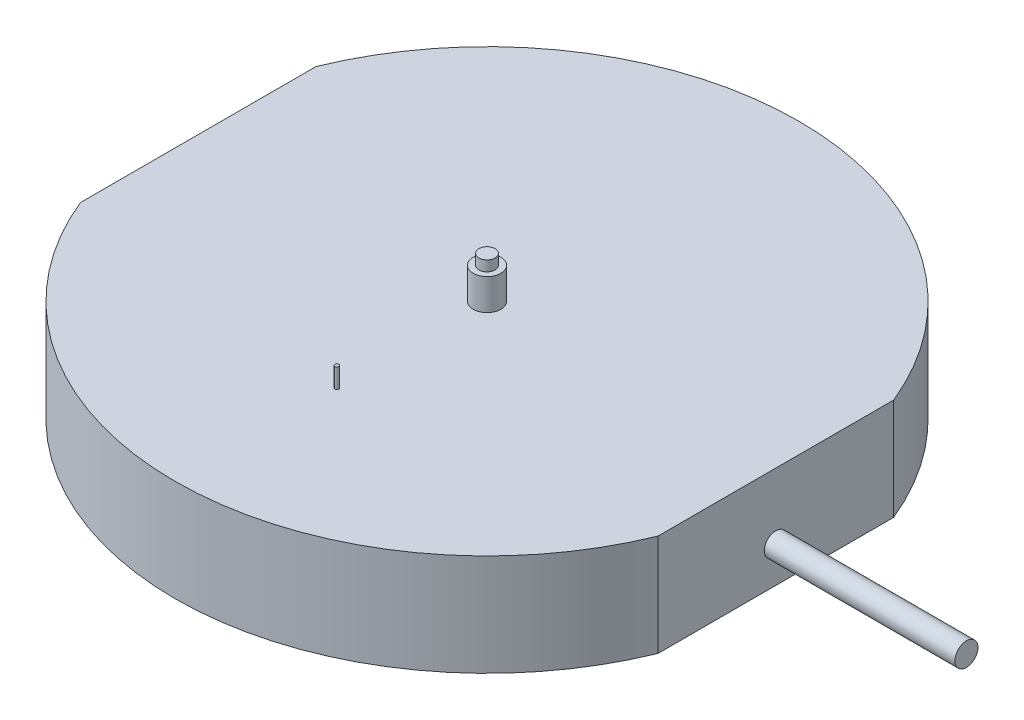
ISO-10303-21;
HEADER;
FILE_DESCRIPTION(('STEP AP214'),'2;1');
FILE_NAME('part.step','',(''),(''),'','','');
FILE_SCHEMA(('AUTOMOTIVE_DESIGN { 1 0 10303 214 1 1 1 1 }'));
ENDSEC;
DATA;
#1=APPLICATION_CONTEXT('core data for automotive mechanical design processes');
#2=APPLICATION_PROTOCOL_DEFINITION('international standard','automotive_design',2000,#1);
#3=PRODUCT_CONTEXT('',#1,'mechanical');
#4=PRODUCT('Part','Part','',(#3));
#5=PRODUCT_RELATED_PRODUCT_CATEGORY('part','',(#4));
#6=PRODUCT_DEFINITION_FORMATION('','',#4);
#7=PRODUCT_DEFINITION_CONTEXT('part definition',#1,'design');
#8=PRODUCT_DEFINITION('design','',#6,#7);
#9=PRODUCT_DEFINITION_SHAPE('','',#8);
#10=(LENGTH_UNIT() NAMED_UNIT(*) SI_UNIT(.MILLI.,.METRE.));
#11=(NAMED_UNIT(*) PLANE_ANGLE_UNIT() SI_UNIT($,.RADIAN.));
#12=(NAMED_UNIT(*) SI_UNIT($,.STERADIAN.) SOLID_ANGLE_UNIT());
#13=UNCERTAINTY_MEASURE_WITH_UNIT(LENGTH_MEASURE(1.E-05),#10,'distance_accuracy_value','');
#14=(GEOMETRIC_REPRESENTATION_CONTEXT(3) GLOBAL_UNCERTAINTY_ASSIGNED_CONTEXT((#13)) GLOBAL_UNIT_ASSIGNED_CONTEXT((#10,
#11,#12)) REPRESENTATION_CONTEXT('',''));
#15=CARTESIAN_POINT('',(0.,0.,0.));
#16=DIRECTION('',(0.,0.,1.));
#17=DIRECTION('',(1.,0.,0.));
#18=AXIS2_PLACEMENT_3D('',#15,#16,#17);
#19=CARTESIAN_POINT('',(0.,4.4,0.));
#20=DIRECTION('',(0.,-1.,0.));
#21=DIRECTION('',(0.,0.,-1.));
#22=AXIS2_PLACEMENT_3D('',#19,#20,#21);
#23=CYLINDRICAL_SURFACE('',#22,13.5);
#24=DIRECTION('',(0.,-1.,0.));
#25=VECTOR('',#24,1.);
#26=CARTESIAN_POINT('',(12.5,4.4,5.09901951359278));
#27=LINE('',#26,#25);
#28=CARTESIAN_POINT('',(12.5,4.4,5.09901951359278));
#29=VERTEX_POINT('',#28);
#30=CARTESIAN_POINT('',(12.5,0.,5.09901951359278));
#31=VERTEX_POINT('',#30);
#32=EDGE_CURVE('E55',#29,#31,#27,.T.);
#33=ORIENTED_EDGE('',*,*,#32,.F.);
#34=CARTESIAN_POINT('',(0.,4.4,0.));
#35=DIRECTION('',(0.,1.,0.));
#36=DIRECTION('',(0.,0.,1.));
#37=AXIS2_PLACEMENT_3D('',#34,#35,#36);
#38=CIRCLE('',#37,13.5);
#39=CARTESIAN_POINT('',(-12.5,4.4,5.09901951359278));
#40=VERTEX_POINT('',#39);
#41=EDGE_CURVE('E85',#40,#29,#38,.T.);
#42=ORIENTED_EDGE('',*,*,#41,.F.);
#43=DIRECTION('',(0.,-1.,0.));
#44=VECTOR('',#43,1.);
#45=CARTESIAN_POINT('',(-12.5,4.4,5.09901951359278));
#46=LINE('',#45,#44);
#47=CARTESIAN_POINT('',(-12.5,0.,5.09901951359278));
#48=VERTEX_POINT('',#47);
#49=EDGE_CURVE('E73',#48,#40,#46,.F.);
#50=ORIENTED_EDGE('',*,*,#49,.F.);
#51=CARTESIAN_POINT('',(0.,0.,0.));
#52=DIRECTION('',(0.,1.,0.));
#53=DIRECTION('',(0.,0.,1.));
#54=AXIS2_PLACEMENT_3D('',#51,#52,#53);
#55=CIRCLE('',#54,13.5);
#56=EDGE_CURVE('E83',#48,#31,#55,.T.);
#57=ORIENTED_EDGE('',*,*,#56,.T.);
#58=EDGE_LOOP('',(#33,#42,#50,#57));
#59=FACE_BOUND('',#58,.T.);
#60=ADVANCED_FACE('F32',(#59),#23,.T.);
#61=DIRECTION('',(0.,-1.,0.));
#62=VECTOR('',#61,1.);
#63=CARTESIAN_POINT('',(12.5,4.4,-5.09901951359278));
#64=LINE('',#63,#62);
#65=CARTESIAN_POINT('',(12.5,0.,-5.09901951359278));
#66=VERTEX_POINT('',#65);
#67=CARTESIAN_POINT('',(12.5,4.4,-5.09901951359278));
#68=VERTEX_POINT('',#67);
#69=EDGE_CURVE('E91',#66,#68,#64,.F.);
#70=ORIENTED_EDGE('',*,*,#69,.F.);
#71=CARTESIAN_POINT('',(-12.5,0.,-5.09901951359278));
#72=VERTEX_POINT('',#71);
#73=EDGE_CURVE('E89',#66,#72,#55,.T.);
#74=ORIENTED_EDGE('',*,*,#73,.T.);
#75=DIRECTION('',(0.,-1.,0.));
#76=VECTOR('',#75,1.);
#77=CARTESIAN_POINT('',(-12.5,4.4,-5.09901951359278));
#78=LINE('',#77,#76);
#79=CARTESIAN_POINT('',(-12.5,4.4,-5.09901951359278));
#80=VERTEX_POINT('',#79);
#81=EDGE_CURVE('E47',#80,#72,#78,.T.);
#82=ORIENTED_EDGE('',*,*,#81,.F.);
#83=EDGE_CURVE('E79',#68,#80,#38,.T.);
#84=ORIENTED_EDGE('',*,*,#83,.F.);
#85=EDGE_LOOP('',(#70,#74,#82,#84));
#86=FACE_BOUND('',#85,.T.);
#87=ADVANCED_FACE('F134',(#86),#23,.T.);
#88=CARTESIAN_POINT('',(0.,4.4,0.));
#89=DIRECTION('',(0.,1.,0.));
#90=DIRECTION('',(0.,0.,1.));
#91=AXIS2_PLACEMENT_3D('',#88,#89,#90);
#92=PLANE('',#91);
#93=CARTESIAN_POINT('',(0.,4.4,6.5));
#94=DIRECTION('',(0.,1.,0.));
#95=DIRECTION('',(0.,0.,1.));
#96=AXIS2_PLACEMENT_3D('',#93,#94,#95);
#97=CIRCLE('',#96,0.0850000000000001);
#98=CARTESIAN_POINT('',(0.,4.4,6.585));
#99=VERTEX_POINT('',#98);
#100=EDGE_CURVE('E116',#99,#99,#97,.T.);
#101=ORIENTED_EDGE('',*,*,#100,.F.);
#102=EDGE_LOOP('',(#101));
#103=FACE_BOUND('',#102,.T.);
#104=CARTESIAN_POINT('',(0.,4.4,0.));
#105=DIRECTION('',(0.,1.,0.));
#106=DIRECTION('',(0.,0.,1.));
#107=AXIS2_PLACEMENT_3D('',#104,#105,#106);
#108=CIRCLE('',#107,0.6);
#109=CARTESIAN_POINT('',(0.,4.4,0.6));
#110=VERTEX_POINT('',#109);
#111=EDGE_CURVE('E101',#110,#110,#108,.T.);
#112=ORIENTED_EDGE('',*,*,#111,.F.);
#113=EDGE_LOOP('',(#112));
#114=FACE_BOUND('',#113,.T.);
#115=ORIENTED_EDGE('',*,*,#41,.T.);
#116=DIRECTION('',(0.,0.,1.));
#117=VECTOR('',#116,1.);
#118=CARTESIAN_POINT('',(12.5,4.4,-15.));
#119=LINE('',#118,#117);
#120=EDGE_CURVE('E86',#68,#29,#119,.T.);
#121=ORIENTED_EDGE('',*,*,#120,.F.);
#122=ORIENTED_EDGE('',*,*,#83,.T.);
#123=DIRECTION('',(0.,0.,-1.));
#124=VECTOR('',#123,1.);
#125=CARTESIAN_POINT('',(-12.5,4.4,15.));
#126=LINE('',#125,#124);
#127=EDGE_CURVE('E97',#40,#80,#126,.T.);
#128=ORIENTED_EDGE('',*,*,#127,.F.);
#129=EDGE_LOOP('',(#115,#121,#122,#128));
#130=FACE_BOUND('',#129,.T.);
#131=ADVANCED_FACE('F131',(#103,#114,#130),#92,.T.);
#132=CARTESIAN_POINT('',(0.,0.,0.));
#133=DIRECTION('',(0.,1.,0.));
#134=DIRECTION('',(0.,0.,1.));
#135=AXIS2_PLACEMENT_3D('',#132,#133,#134);
#136=PLANE('',#135);
#137=DIRECTION('',(0.,0.,-1.));
#138=VECTOR('',#137,1.);
#139=CARTESIAN_POINT('',(12.5,0.,0.));
#140=LINE('',#139,#138);
#141=EDGE_CURVE('E35',#31,#66,#140,.T.);
#142=ORIENTED_EDGE('',*,*,#141,.F.);
#143=ORIENTED_EDGE('',*,*,#56,.F.);
#144=DIRECTION('',(0.,0.,1.));
#145=VECTOR('',#144,1.);
#146=CARTESIAN_POINT('',(-12.5,0.,0.));
#147=LINE('',#146,#145);
#148=EDGE_CURVE('E70',#72,#48,#147,.T.);
#149=ORIENTED_EDGE('',*,*,#148,.F.);
#150=ORIENTED_EDGE('',*,*,#73,.F.);
#151=EDGE_LOOP('',(#142,#143,#149,#150));
#152=FACE_BOUND('',#151,.T.);
#153=ADVANCED_FACE('F88',(#152),#136,.F.);
#154=CARTESIAN_POINT('',(-12.5,4.4,15.));
#155=DIRECTION('',(-1.,0.,0.));
#156=DIRECTION('',(0.,0.,1.));
#157=AXIS2_PLACEMENT_3D('',#154,#155,#156);
#158=PLANE('',#157);
#159=ORIENTED_EDGE('',*,*,#81,.T.);
#160=ORIENTED_EDGE('',*,*,#148,.T.);
#161=ORIENTED_EDGE('',*,*,#49,.T.);
#162=ORIENTED_EDGE('',*,*,#127,.T.);
#163=EDGE_LOOP('',(#159,#160,#161,#162));
#164=FACE_BOUND('',#163,.T.);
#165=ADVANCED_FACE('F72',(#164),#158,.T.);
#166=CARTESIAN_POINT('',(12.5,4.4,-15.));
#167=DIRECTION('',(1.,0.,0.));
#168=DIRECTION('',(0.,0.,-1.));
#169=AXIS2_PLACEMENT_3D('',#166,#167,#168);
#170=PLANE('',#169);
#171=CARTESIAN_POINT('',(12.5,1.55,0.));
#172=DIRECTION('',(1.,0.,0.));
#173=DIRECTION('',(0.,0.,-1.));
#174=AXIS2_PLACEMENT_3D('',#171,#172,#173);
#175=CIRCLE('',#174,0.5);
#176=CARTESIAN_POINT('',(12.5,1.55,-0.5));
#177=VERTEX_POINT('',#176);
#178=EDGE_CURVE('E110',#177,#177,#175,.T.);
#179=ORIENTED_EDGE('',*,*,#178,.F.);
#180=EDGE_LOOP('',(#179));
#181=FACE_BOUND('',#180,.T.);
#182=ORIENTED_EDGE('',*,*,#32,.T.);
#183=ORIENTED_EDGE('',*,*,#141,.T.);
#184=ORIENTED_EDGE('',*,*,#69,.T.);
#185=ORIENTED_EDGE('',*,*,#120,.T.);
#186=EDGE_LOOP('',(#182,#183,#184,#185));
#187=FACE_BOUND('',#186,.T.);
#188=ADVANCED_FACE('F143',(#181,#187),#170,.T.);
#189=CARTESIAN_POINT('',(0.,5.75,0.));
#190=DIRECTION('',(0.,-1.,0.));
#191=DIRECTION('',(0.,0.,-1.));
#192=AXIS2_PLACEMENT_3D('',#189,#190,#191);
#193=CYLINDRICAL_SURFACE('',#192,0.6);
#194=CARTESIAN_POINT('',(0.,5.75,0.));
#195=DIRECTION('',(0.,1.,0.));
#196=DIRECTION('',(0.,0.,1.));
#197=AXIS2_PLACEMENT_3D('',#194,#195,#196);
#198=CIRCLE('',#197,0.6);
#199=CARTESIAN_POINT('',(0.,5.75,0.6));
#200=VERTEX_POINT('',#199);
#201=EDGE_CURVE('E99',#200,#200,#198,.T.);
#202=ORIENTED_EDGE('',*,*,#201,.F.);
#203=EDGE_LOOP('',(#202));
#204=FACE_BOUND('',#203,.T.);
#205=ORIENTED_EDGE('',*,*,#111,.T.);
#206=EDGE_LOOP('',(#205));
#207=FACE_BOUND('',#206,.T.);
#208=ADVANCED_FACE('F145',(#204,#207),#193,.T.);
#209=CARTESIAN_POINT('',(0.,5.75,0.));
#210=DIRECTION('',(0.,1.,0.));
#211=DIRECTION('',(0.,0.,1.));
#212=AXIS2_PLACEMENT_3D('',#209,#210,#211);
#213=PLANE('',#212);
#214=CARTESIAN_POINT('',(0.,5.75,0.));
#215=DIRECTION('',(0.,1.,0.));
#216=DIRECTION('',(0.,0.,1.));
#217=AXIS2_PLACEMENT_3D('',#214,#215,#216);
#218=CIRCLE('',#217,0.35);
#219=CARTESIAN_POINT('',(0.,5.75,0.35));
#220=VERTEX_POINT('',#219);
#221=EDGE_CURVE('E11',#220,#220,#218,.T.);
#222=ORIENTED_EDGE('',*,*,#221,.F.);
#223=EDGE_LOOP('',(#222));
#224=FACE_BOUND('',#223,.T.);
#225=ORIENTED_EDGE('',*,*,#201,.T.);
#226=EDGE_LOOP('',(#225));
#227=FACE_BOUND('',#226,.T.);
#228=ADVANCED_FACE('F152',(#224,#227),#213,.T.);
#229=CARTESIAN_POINT('',(0.,6.2,0.));
#230=DIRECTION('',(0.,-1.,0.));
#231=DIRECTION('',(0.,0.,-1.));
#232=AXIS2_PLACEMENT_3D('',#229,#230,#231);
#233=CYLINDRICAL_SURFACE('',#232,0.35);
#234=CARTESIAN_POINT('',(0.,6.2,0.));
#235=DIRECTION('',(0.,1.,0.));
#236=DIRECTION('',(0.,0.,1.));
#237=AXIS2_PLACEMENT_3D('',#234,#235,#236);
#238=CIRCLE('',#237,0.35);
#239=CARTESIAN_POINT('',(0.,6.2,0.35));
#240=VERTEX_POINT('',#239);
#241=EDGE_CURVE('E104',#240,#240,#238,.T.);
#242=ORIENTED_EDGE('',*,*,#241,.F.);
#243=EDGE_LOOP('',(#242));
#244=FACE_BOUND('',#243,.T.);
#245=ORIENTED_EDGE('',*,*,#221,.T.);
#246=EDGE_LOOP('',(#245));
#247=FACE_BOUND('',#246,.T.);
#248=ADVANCED_FACE('F195',(#244,#247),#233,.T.);
#249=CARTESIAN_POINT('',(0.,6.2,0.));
#250=DIRECTION('',(0.,1.,0.));
#251=DIRECTION('',(0.,0.,1.));
#252=AXIS2_PLACEMENT_3D('',#249,#250,#251);
#253=PLANE('',#252);
#254=ORIENTED_EDGE('',*,*,#241,.T.);
#255=EDGE_LOOP('',(#254));
#256=FACE_BOUND('',#255,.T.);
#257=ADVANCED_FACE('F205',(#256),#253,.T.);
#258=CARTESIAN_POINT('',(20.75,1.55,0.));
#259=DIRECTION('',(-1.,0.,0.));
#260=DIRECTION('',(0.,0.,1.));
#261=AXIS2_PLACEMENT_3D('',#258,#259,#260);
#262=CYLINDRICAL_SURFACE('',#261,0.5);
#263=CARTESIAN_POINT('',(20.75,1.55,0.));
#264=DIRECTION('',(1.,0.,0.));
#265=DIRECTION('',(0.,0.,-1.));
#266=AXIS2_PLACEMENT_3D('',#263,#264,#265);
#267=CIRCLE('',#266,0.5);
#268=CARTESIAN_POINT('',(20.75,1.55,-0.5));
#269=VERTEX_POINT('',#268);
#270=EDGE_CURVE('E109',#269,#269,#267,.T.);
#271=ORIENTED_EDGE('',*,*,#270,.F.);
#272=EDGE_LOOP('',(#271));
#273=FACE_BOUND('',#272,.T.);
#274=ORIENTED_EDGE('',*,*,#178,.T.);
#275=EDGE_LOOP('',(#274));
#276=FACE_BOUND('',#275,.T.);
#277=ADVANCED_FACE('F214',(#273,#276),#262,.T.);
#278=CARTESIAN_POINT('',(20.75,1.55,0.));
#279=DIRECTION('',(1.,0.,0.));
#280=DIRECTION('',(0.,0.,-1.));
#281=AXIS2_PLACEMENT_3D('',#278,#279,#280);
#282=PLANE('',#281);
#283=ORIENTED_EDGE('',*,*,#270,.T.);
#284=EDGE_LOOP('',(#283));
#285=FACE_BOUND('',#284,.T.);
#286=ADVANCED_FACE('F127',(#285),#282,.T.);
#287=CARTESIAN_POINT('',(0.,5.25,6.5));
#288=DIRECTION('',(0.,-1.,0.));
#289=DIRECTION('',(0.,0.,-1.));
#290=AXIS2_PLACEMENT_3D('',#287,#288,#289);
#291=CYLINDRICAL_SURFACE('',#290,0.0850000000000001);
#292=CARTESIAN_POINT('',(0.,5.25,6.5));
#293=DIRECTION('',(0.,1.,0.));
#294=DIRECTION('',(0.,0.,1.));
#295=AXIS2_PLACEMENT_3D('',#292,#293,#294);
#296=CIRCLE('',#295,0.0850000000000001);
#297=CARTESIAN_POINT('',(0.,5.25,6.585));
#298=VERTEX_POINT('',#297);
#299=EDGE_CURVE('E113',#298,#298,#296,.T.);
#300=ORIENTED_EDGE('',*,*,#299,.F.);
#301=EDGE_LOOP('',(#300));
#302=FACE_BOUND('',#301,.T.);
#303=ORIENTED_EDGE('',*,*,#100,.T.);
#304=EDGE_LOOP('',(#303));
#305=FACE_BOUND('',#304,.T.);
#306=ADVANCED_FACE('F124',(#302,#305),#291,.T.);
#307=CARTESIAN_POINT('',(0.,5.25,6.5));
#308=DIRECTION('',(0.,1.,0.));
#309=DIRECTION('',(0.,0.,1.));
#310=AXIS2_PLACEMENT_3D('',#307,#308,#309);
#311=PLANE('',#310);
#312=ORIENTED_EDGE('',*,*,#299,.T.);
#313=EDGE_LOOP('',(#312));
#314=FACE_BOUND('',#313,.T.);
#315=ADVANCED_FACE('F122',(#314),#311,.T.);
#316=CLOSED_SHELL('',(#60,#87,#131,#153,#165,#188,#208,#228,#248,#257,#277,#286,#306,#315));
#317=MANIFOLD_SOLID_BREP('B2',#316);
#318=ADVANCED_BREP_SHAPE_REPRESENTATION('',(#18,#317),#14);
#319=SHAPE_DEFINITION_REPRESENTATION(#9,#318);
ENDSEC;
END-ISO-10303-21;
